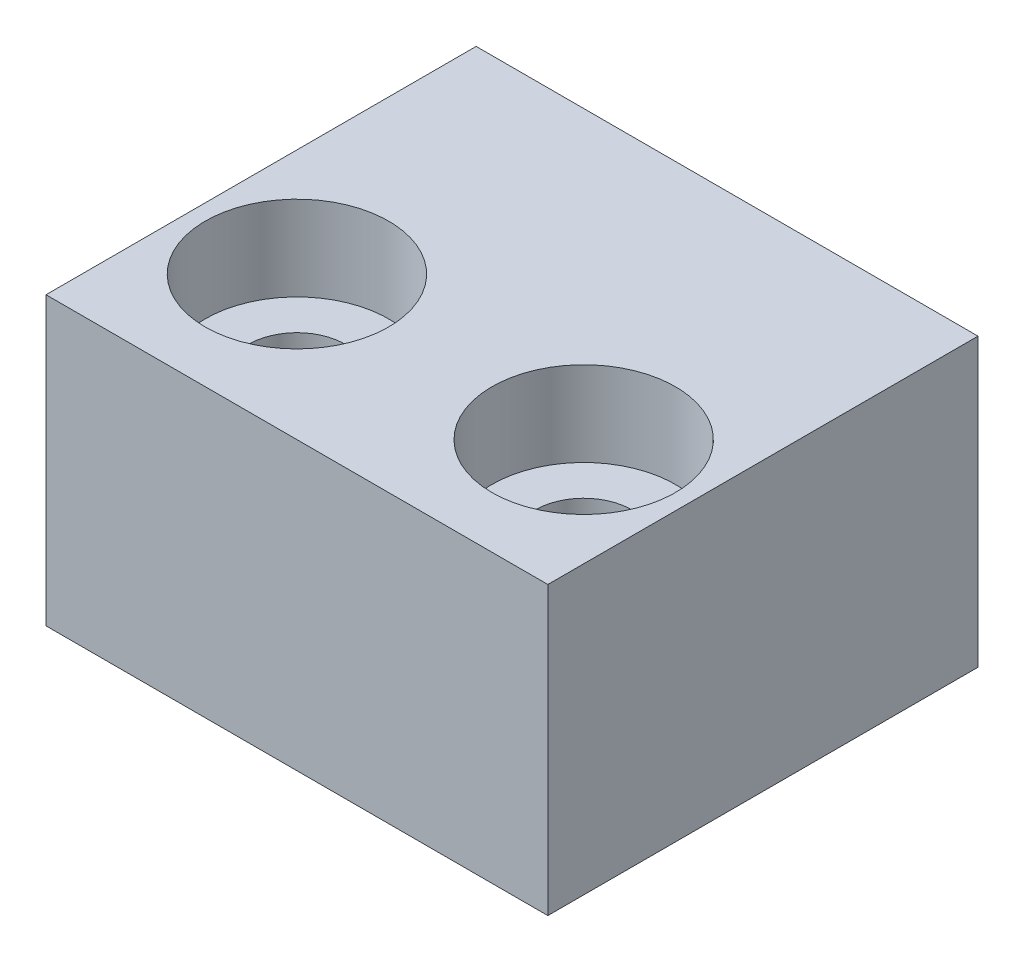
ISO-10303-21;
HEADER;
FILE_DESCRIPTION(('STEP AP214'),'2;1');
FILE_NAME('part.step','',(''),(''),'','','');
FILE_SCHEMA(('AUTOMOTIVE_DESIGN { 1 0 10303 214 1 1 1 1 }'));
ENDSEC;
DATA;
#1=APPLICATION_CONTEXT('core data for automotive mechanical design processes');
#2=APPLICATION_PROTOCOL_DEFINITION('international standard','automotive_design',2000,#1);
#3=PRODUCT_CONTEXT('',#1,'mechanical');
#4=PRODUCT('Part','Part','',(#3));
#5=PRODUCT_RELATED_PRODUCT_CATEGORY('part','',(#4));
#6=PRODUCT_DEFINITION_FORMATION('','',#4);
#7=PRODUCT_DEFINITION_CONTEXT('part definition',#1,'design');
#8=PRODUCT_DEFINITION('design','',#6,#7);
#9=PRODUCT_DEFINITION_SHAPE('','',#8);
#10=(LENGTH_UNIT() NAMED_UNIT(*) SI_UNIT(.MILLI.,.METRE.));
#11=(NAMED_UNIT(*) PLANE_ANGLE_UNIT() SI_UNIT($,.RADIAN.));
#12=(NAMED_UNIT(*) SI_UNIT($,.STERADIAN.) SOLID_ANGLE_UNIT());
#13=UNCERTAINTY_MEASURE_WITH_UNIT(LENGTH_MEASURE(1.E-05),#10,'distance_accuracy_value','');
#14=(GEOMETRIC_REPRESENTATION_CONTEXT(3) GLOBAL_UNCERTAINTY_ASSIGNED_CONTEXT((#13)) GLOBAL_UNIT_ASSIGNED_CONTEXT((#10,
#11,#12)) REPRESENTATION_CONTEXT('',''));
#15=CARTESIAN_POINT('',(0.,0.,0.));
#16=DIRECTION('',(0.,0.,1.));
#17=DIRECTION('',(1.,0.,0.));
#18=AXIS2_PLACEMENT_3D('',#15,#16,#17);
#19=CARTESIAN_POINT('',(0.,10.16,0.));
#20=DIRECTION('',(1.,0.,0.));
#21=DIRECTION('',(0.,0.,-1.));
#22=AXIS2_PLACEMENT_3D('',#19,#20,#21);
#23=PLANE('',#22);
#24=DIRECTION('',(0.,0.,1.));
#25=VECTOR('',#24,1.);
#26=CARTESIAN_POINT('',(0.,0.,0.));
#27=LINE('',#26,#25);
#28=CARTESIAN_POINT('',(0.,0.,-15.24));
#29=VERTEX_POINT('',#28);
#30=CARTESIAN_POINT('',(0.,0.,0.));
#31=VERTEX_POINT('',#30);
#32=EDGE_CURVE('E113',#29,#31,#27,.T.);
#33=ORIENTED_EDGE('',*,*,#32,.T.);
#34=DIRECTION('',(0.,-1.,0.));
#35=VECTOR('',#34,1.);
#36=CARTESIAN_POINT('',(0.,10.16,0.));
#37=LINE('',#36,#35);
#38=CARTESIAN_POINT('',(0.,10.16,0.));
#39=VERTEX_POINT('',#38);
#40=EDGE_CURVE('E11',#39,#31,#37,.T.);
#41=ORIENTED_EDGE('',*,*,#40,.F.);
#42=DIRECTION('',(0.,0.,1.));
#43=VECTOR('',#42,1.);
#44=CARTESIAN_POINT('',(0.,10.16,0.));
#45=LINE('',#44,#43);
#46=CARTESIAN_POINT('',(0.,10.16,-15.24));
#47=VERTEX_POINT('',#46);
#48=EDGE_CURVE('E97',#47,#39,#45,.T.);
#49=ORIENTED_EDGE('',*,*,#48,.F.);
#50=DIRECTION('',(0.,-1.,0.));
#51=VECTOR('',#50,1.);
#52=CARTESIAN_POINT('',(0.,10.16,-15.24));
#53=LINE('',#52,#51);
#54=EDGE_CURVE('E109',#47,#29,#53,.T.);
#55=ORIENTED_EDGE('',*,*,#54,.T.);
#56=EDGE_LOOP('',(#33,#41,#49,#55));
#57=FACE_BOUND('',#56,.T.);
#58=ADVANCED_FACE('F45',(#57),#23,.F.);
#59=CARTESIAN_POINT('',(0.,10.16,0.));
#60=DIRECTION('',(0.,0.,-1.));
#61=DIRECTION('',(-1.,0.,0.));
#62=AXIS2_PLACEMENT_3D('',#59,#60,#61);
#63=PLANE('',#62);
#64=DIRECTION('',(1.,0.,0.));
#65=VECTOR('',#64,1.);
#66=CARTESIAN_POINT('',(0.,0.,0.));
#67=LINE('',#66,#65);
#68=CARTESIAN_POINT('',(17.78,0.,0.));
#69=VERTEX_POINT('',#68);
#70=EDGE_CURVE('E102',#31,#69,#67,.T.);
#71=ORIENTED_EDGE('',*,*,#70,.T.);
#72=DIRECTION('',(0.,-1.,0.));
#73=VECTOR('',#72,1.);
#74=CARTESIAN_POINT('',(17.78,10.16,0.));
#75=LINE('',#74,#73);
#76=CARTESIAN_POINT('',(17.78,10.16,0.));
#77=VERTEX_POINT('',#76);
#78=EDGE_CURVE('E54',#77,#69,#75,.T.);
#79=ORIENTED_EDGE('',*,*,#78,.F.);
#80=DIRECTION('',(1.,0.,0.));
#81=VECTOR('',#80,1.);
#82=CARTESIAN_POINT('',(0.,10.16,0.));
#83=LINE('',#82,#81);
#84=EDGE_CURVE('E92',#39,#77,#83,.T.);
#85=ORIENTED_EDGE('',*,*,#84,.F.);
#86=ORIENTED_EDGE('',*,*,#40,.T.);
#87=EDGE_LOOP('',(#71,#79,#85,#86));
#88=FACE_BOUND('',#87,.T.);
#89=ADVANCED_FACE('F101',(#88),#63,.F.);
#90=CARTESIAN_POINT('',(17.78,10.16,0.));
#91=DIRECTION('',(-1.,0.,0.));
#92=DIRECTION('',(0.,0.,1.));
#93=AXIS2_PLACEMENT_3D('',#90,#91,#92);
#94=PLANE('',#93);
#95=DIRECTION('',(0.,0.,-1.));
#96=VECTOR('',#95,1.);
#97=CARTESIAN_POINT('',(17.78,0.,0.));
#98=LINE('',#97,#96);
#99=CARTESIAN_POINT('',(17.78,0.,-15.24));
#100=VERTEX_POINT('',#99);
#101=EDGE_CURVE('E79',#69,#100,#98,.T.);
#102=ORIENTED_EDGE('',*,*,#101,.T.);
#103=DIRECTION('',(0.,-1.,0.));
#104=VECTOR('',#103,1.);
#105=CARTESIAN_POINT('',(17.78,10.16,-15.24));
#106=LINE('',#105,#104);
#107=CARTESIAN_POINT('',(17.78,10.16,-15.24));
#108=VERTEX_POINT('',#107);
#109=EDGE_CURVE('E104',#108,#100,#106,.T.);
#110=ORIENTED_EDGE('',*,*,#109,.F.);
#111=DIRECTION('',(0.,0.,-1.));
#112=VECTOR('',#111,1.);
#113=CARTESIAN_POINT('',(17.78,10.16,0.));
#114=LINE('',#113,#112);
#115=EDGE_CURVE('E95',#77,#108,#114,.T.);
#116=ORIENTED_EDGE('',*,*,#115,.F.);
#117=ORIENTED_EDGE('',*,*,#78,.T.);
#118=EDGE_LOOP('',(#102,#110,#116,#117));
#119=FACE_BOUND('',#118,.T.);
#120=ADVANCED_FACE('F105',(#119),#94,.F.);
#121=CARTESIAN_POINT('',(0.,10.16,-15.24));
#122=DIRECTION('',(0.,0.,1.));
#123=DIRECTION('',(1.,0.,0.));
#124=AXIS2_PLACEMENT_3D('',#121,#122,#123);
#125=PLANE('',#124);
#126=DIRECTION('',(-1.,0.,0.));
#127=VECTOR('',#126,1.);
#128=CARTESIAN_POINT('',(0.,0.,-15.24));
#129=LINE('',#128,#127);
#130=EDGE_CURVE('E85',#100,#29,#129,.T.);
#131=ORIENTED_EDGE('',*,*,#130,.T.);
#132=ORIENTED_EDGE('',*,*,#54,.F.);
#133=DIRECTION('',(-1.,0.,0.));
#134=VECTOR('',#133,1.);
#135=CARTESIAN_POINT('',(0.,10.16,-15.24));
#136=LINE('',#135,#134);
#137=EDGE_CURVE('E62',#108,#47,#136,.T.);
#138=ORIENTED_EDGE('',*,*,#137,.F.);
#139=ORIENTED_EDGE('',*,*,#109,.T.);
#140=EDGE_LOOP('',(#131,#132,#138,#139));
#141=FACE_BOUND('',#140,.T.);
#142=ADVANCED_FACE('F127',(#141),#125,.F.);
#143=CARTESIAN_POINT('',(0.,10.16,0.));
#144=DIRECTION('',(0.,-1.,0.));
#145=DIRECTION('',(0.,0.,-1.));
#146=AXIS2_PLACEMENT_3D('',#143,#144,#145);
#147=PLANE('',#146);
#148=CARTESIAN_POINT('',(3.81,10.16,-5.08));
#149=DIRECTION('',(0.,1.,0.));
#150=DIRECTION('',(0.,0.,1.));
#151=AXIS2_PLACEMENT_3D('',#148,#149,#150);
#152=CIRCLE('',#151,3.25);
#153=CARTESIAN_POINT('',(3.81,10.16,-1.83));
#154=VERTEX_POINT('',#153);
#155=EDGE_CURVE('E161',#154,#154,#152,.T.);
#156=ORIENTED_EDGE('',*,*,#155,.F.);
#157=EDGE_LOOP('',(#156));
#158=FACE_BOUND('',#157,.T.);
#159=CARTESIAN_POINT('',(13.97,10.16,-5.08));
#160=DIRECTION('',(0.,1.,0.));
#161=DIRECTION('',(0.,0.,1.));
#162=AXIS2_PLACEMENT_3D('',#159,#160,#161);
#163=CIRCLE('',#162,3.25);
#164=CARTESIAN_POINT('',(13.97,10.16,-1.83));
#165=VERTEX_POINT('',#164);
#166=EDGE_CURVE('E145',#165,#165,#163,.T.);
#167=ORIENTED_EDGE('',*,*,#166,.F.);
#168=EDGE_LOOP('',(#167));
#169=FACE_BOUND('',#168,.T.);
#170=ORIENTED_EDGE('',*,*,#48,.T.);
#171=ORIENTED_EDGE('',*,*,#84,.T.);
#172=ORIENTED_EDGE('',*,*,#115,.T.);
#173=ORIENTED_EDGE('',*,*,#137,.T.);
#174=EDGE_LOOP('',(#170,#171,#172,#173));
#175=FACE_BOUND('',#174,.T.);
#176=ADVANCED_FACE('F93',(#158,#169,#175),#147,.F.);
#177=CARTESIAN_POINT('',(0.,0.,0.));
#178=DIRECTION('',(0.,-1.,0.));
#179=DIRECTION('',(0.,0.,-1.));
#180=AXIS2_PLACEMENT_3D('',#177,#178,#179);
#181=PLANE('',#180);
#182=CARTESIAN_POINT('',(3.81,0.,-5.08));
#183=DIRECTION('',(0.,1.,0.));
#184=DIRECTION('',(0.,0.,1.));
#185=AXIS2_PLACEMENT_3D('',#182,#183,#184);
#186=CIRCLE('',#185,1.7);
#187=CARTESIAN_POINT('',(3.81,0.,-3.38));
#188=VERTEX_POINT('',#187);
#189=EDGE_CURVE('E149',#188,#188,#186,.T.);
#190=ORIENTED_EDGE('',*,*,#189,.T.);
#191=EDGE_LOOP('',(#190));
#192=FACE_BOUND('',#191,.T.);
#193=CARTESIAN_POINT('',(13.97,0.,-5.08));
#194=DIRECTION('',(0.,1.,0.));
#195=DIRECTION('',(0.,0.,1.));
#196=AXIS2_PLACEMENT_3D('',#193,#194,#195);
#197=CIRCLE('',#196,1.7);
#198=CARTESIAN_POINT('',(13.97,0.,-3.38));
#199=VERTEX_POINT('',#198);
#200=EDGE_CURVE('E117',#199,#199,#197,.T.);
#201=ORIENTED_EDGE('',*,*,#200,.T.);
#202=EDGE_LOOP('',(#201));
#203=FACE_BOUND('',#202,.T.);
#204=ORIENTED_EDGE('',*,*,#32,.F.);
#205=ORIENTED_EDGE('',*,*,#130,.F.);
#206=ORIENTED_EDGE('',*,*,#101,.F.);
#207=ORIENTED_EDGE('',*,*,#70,.F.);
#208=EDGE_LOOP('',(#204,#205,#206,#207));
#209=FACE_BOUND('',#208,.T.);
#210=ADVANCED_FACE('F130',(#192,#203,#209),#181,.T.);
#211=CARTESIAN_POINT('',(13.97,10.16,-5.08));
#212=DIRECTION('',(0.,1.,0.));
#213=DIRECTION('',(0.,0.,1.));
#214=AXIS2_PLACEMENT_3D('',#211,#212,#213);
#215=CYLINDRICAL_SURFACE('',#214,1.7);
#216=ORIENTED_EDGE('',*,*,#200,.F.);
#217=EDGE_LOOP('',(#216));
#218=FACE_BOUND('',#217,.T.);
#219=CARTESIAN_POINT('',(13.97,7.16,-5.08));
#220=DIRECTION('',(0.,1.,0.));
#221=DIRECTION('',(0.,0.,1.));
#222=AXIS2_PLACEMENT_3D('',#219,#220,#221);
#223=CIRCLE('',#222,1.7);
#224=CARTESIAN_POINT('',(13.97,7.16,-3.38));
#225=VERTEX_POINT('',#224);
#226=EDGE_CURVE('E137',#225,#225,#223,.T.);
#227=ORIENTED_EDGE('',*,*,#226,.T.);
#228=EDGE_LOOP('',(#227));
#229=FACE_BOUND('',#228,.T.);
#230=ADVANCED_FACE('F186',(#218,#229),#215,.F.);
#231=CARTESIAN_POINT('',(15.67,7.16,-5.08));
#232=DIRECTION('',(0.,-1.,0.));
#233=DIRECTION('',(0.,0.,-1.));
#234=AXIS2_PLACEMENT_3D('',#231,#232,#233);
#235=PLANE('',#234);
#236=ORIENTED_EDGE('',*,*,#226,.F.);
#237=EDGE_LOOP('',(#236));
#238=FACE_BOUND('',#237,.T.);
#239=CARTESIAN_POINT('',(13.97,7.16,-5.08));
#240=DIRECTION('',(0.,1.,0.));
#241=DIRECTION('',(0.,0.,1.));
#242=AXIS2_PLACEMENT_3D('',#239,#240,#241);
#243=CIRCLE('',#242,3.25);
#244=CARTESIAN_POINT('',(13.97,7.16,-1.83));
#245=VERTEX_POINT('',#244);
#246=EDGE_CURVE('E141',#245,#245,#243,.T.);
#247=ORIENTED_EDGE('',*,*,#246,.T.);
#248=EDGE_LOOP('',(#247));
#249=FACE_BOUND('',#248,.T.);
#250=ADVANCED_FACE('F176',(#238,#249),#235,.F.);
#251=CARTESIAN_POINT('',(13.97,10.16,-5.08));
#252=DIRECTION('',(0.,1.,0.));
#253=DIRECTION('',(0.,0.,1.));
#254=AXIS2_PLACEMENT_3D('',#251,#252,#253);
#255=CYLINDRICAL_SURFACE('',#254,3.25);
#256=ORIENTED_EDGE('',*,*,#246,.F.);
#257=EDGE_LOOP('',(#256));
#258=FACE_BOUND('',#257,.T.);
#259=ORIENTED_EDGE('',*,*,#166,.T.);
#260=EDGE_LOOP('',(#259));
#261=FACE_BOUND('',#260,.T.);
#262=ADVANCED_FACE('F173',(#258,#261),#255,.F.);
#263=CARTESIAN_POINT('',(3.81,10.16,-5.08));
#264=DIRECTION('',(0.,1.,0.));
#265=DIRECTION('',(0.,0.,1.));
#266=AXIS2_PLACEMENT_3D('',#263,#264,#265);
#267=CYLINDRICAL_SURFACE('',#266,1.7);
#268=ORIENTED_EDGE('',*,*,#189,.F.);
#269=EDGE_LOOP('',(#268));
#270=FACE_BOUND('',#269,.T.);
#271=CARTESIAN_POINT('',(3.81,7.16,-5.08));
#272=DIRECTION('',(0.,1.,0.));
#273=DIRECTION('',(0.,0.,1.));
#274=AXIS2_PLACEMENT_3D('',#271,#272,#273);
#275=CIRCLE('',#274,1.7);
#276=CARTESIAN_POINT('',(3.81,7.16,-3.38));
#277=VERTEX_POINT('',#276);
#278=EDGE_CURVE('E153',#277,#277,#275,.T.);
#279=ORIENTED_EDGE('',*,*,#278,.T.);
#280=EDGE_LOOP('',(#279));
#281=FACE_BOUND('',#280,.T.);
#282=ADVANCED_FACE('F175',(#270,#281),#267,.F.);
#283=CARTESIAN_POINT('',(5.51,7.16,-5.08));
#284=DIRECTION('',(0.,-1.,0.));
#285=DIRECTION('',(0.,0.,-1.));
#286=AXIS2_PLACEMENT_3D('',#283,#284,#285);
#287=PLANE('',#286);
#288=ORIENTED_EDGE('',*,*,#278,.F.);
#289=EDGE_LOOP('',(#288));
#290=FACE_BOUND('',#289,.T.);
#291=CARTESIAN_POINT('',(3.81,7.16,-5.08));
#292=DIRECTION('',(0.,1.,0.));
#293=DIRECTION('',(0.,0.,1.));
#294=AXIS2_PLACEMENT_3D('',#291,#292,#293);
#295=CIRCLE('',#294,3.25);
#296=CARTESIAN_POINT('',(3.81,7.16,-1.83));
#297=VERTEX_POINT('',#296);
#298=EDGE_CURVE('E157',#297,#297,#295,.T.);
#299=ORIENTED_EDGE('',*,*,#298,.T.);
#300=EDGE_LOOP('',(#299));
#301=FACE_BOUND('',#300,.T.);
#302=ADVANCED_FACE('F183',(#290,#301),#287,.F.);
#303=CARTESIAN_POINT('',(3.81,10.16,-5.08));
#304=DIRECTION('',(0.,1.,0.));
#305=DIRECTION('',(0.,0.,1.));
#306=AXIS2_PLACEMENT_3D('',#303,#304,#305);
#307=CYLINDRICAL_SURFACE('',#306,3.25);
#308=ORIENTED_EDGE('',*,*,#298,.F.);
#309=EDGE_LOOP('',(#308));
#310=FACE_BOUND('',#309,.T.);
#311=ORIENTED_EDGE('',*,*,#155,.T.);
#312=EDGE_LOOP('',(#311));
#313=FACE_BOUND('',#312,.T.);
#314=ADVANCED_FACE('F166',(#310,#313),#307,.F.);
#315=CLOSED_SHELL('',(#58,#89,#120,#142,#176,#210,#230,#250,#262,#282,#302,#314));
#316=MANIFOLD_SOLID_BREP('B2',#315);
#317=ADVANCED_BREP_SHAPE_REPRESENTATION('',(#18,#316),#14);
#318=SHAPE_DEFINITION_REPRESENTATION(#9,#317);
ENDSEC;
END-ISO-10303-21;
